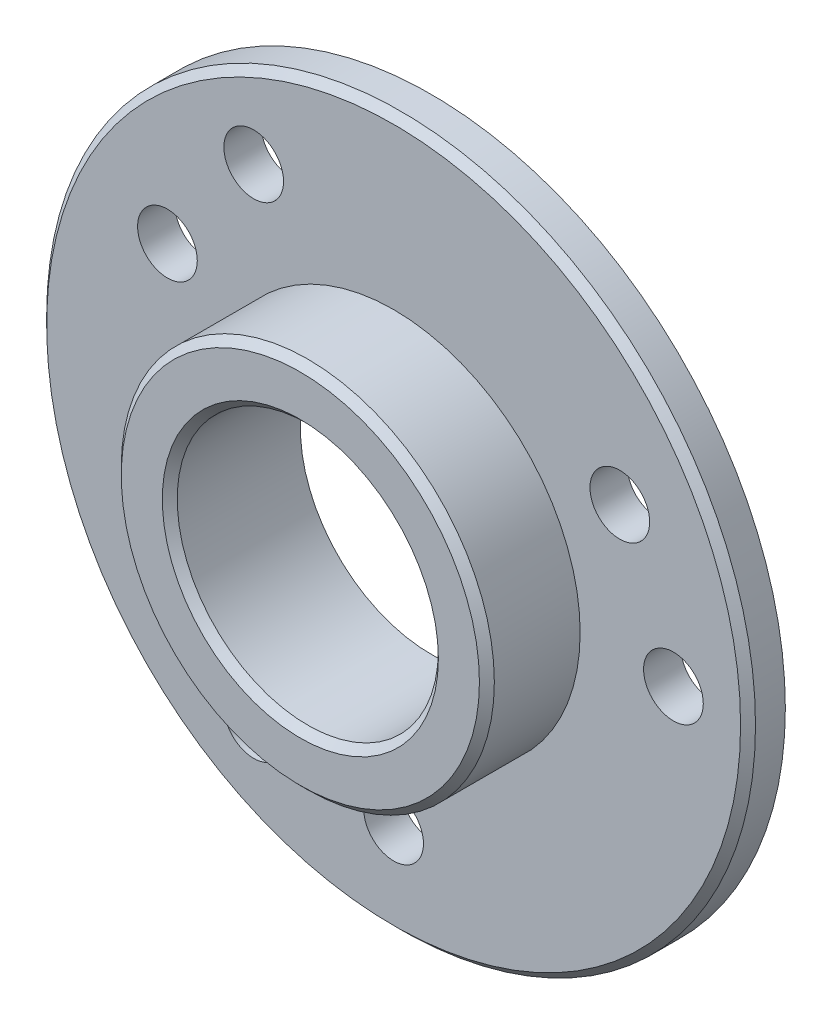
ISO-10303-21;
HEADER;
FILE_DESCRIPTION(('STEP AP214'),'2;1');
FILE_NAME('part.step','',(''),(''),'','','');
FILE_SCHEMA(('AUTOMOTIVE_DESIGN { 1 0 10303 214 1 1 1 1 }'));
ENDSEC;
DATA;
#1=APPLICATION_CONTEXT('core data for automotive mechanical design processes');
#2=APPLICATION_PROTOCOL_DEFINITION('international standard','automotive_design',2000,#1);
#3=PRODUCT_CONTEXT('',#1,'mechanical');
#4=PRODUCT('Part','Part','',(#3));
#5=PRODUCT_RELATED_PRODUCT_CATEGORY('part','',(#4));
#6=PRODUCT_DEFINITION_FORMATION('','',#4);
#7=PRODUCT_DEFINITION_CONTEXT('part definition',#1,'design');
#8=PRODUCT_DEFINITION('design','',#6,#7);
#9=PRODUCT_DEFINITION_SHAPE('','',#8);
#10=(LENGTH_UNIT() NAMED_UNIT(*) SI_UNIT(.MILLI.,.METRE.));
#11=(NAMED_UNIT(*) PLANE_ANGLE_UNIT() SI_UNIT($,.RADIAN.));
#12=(NAMED_UNIT(*) SI_UNIT($,.STERADIAN.) SOLID_ANGLE_UNIT());
#13=UNCERTAINTY_MEASURE_WITH_UNIT(LENGTH_MEASURE(1.E-05),#10,'distance_accuracy_value','');
#14=(GEOMETRIC_REPRESENTATION_CONTEXT(3) GLOBAL_UNCERTAINTY_ASSIGNED_CONTEXT((#13)) GLOBAL_UNIT_ASSIGNED_CONTEXT((#10,
#11,#12)) REPRESENTATION_CONTEXT('',''));
#15=CARTESIAN_POINT('',(0.,0.,0.));
#16=DIRECTION('',(0.,0.,1.));
#17=DIRECTION('',(1.,0.,0.));
#18=AXIS2_PLACEMENT_3D('',#15,#16,#17);
#19=CARTESIAN_POINT('',(0.,0.,2.));
#20=DIRECTION('',(0.,0.,1.));
#21=DIRECTION('',(1.,0.,0.));
#22=AXIS2_PLACEMENT_3D('',#19,#20,#21);
#23=PLANE('',#22);
#24=CARTESIAN_POINT('',(0.,0.,2.));
#25=DIRECTION('',(0.,0.,1.));
#26=DIRECTION('',(1.,0.,0.));
#27=AXIS2_PLACEMENT_3D('',#24,#25,#26);
#28=CIRCLE('',#27,18.6);
#29=CARTESIAN_POINT('',(18.6,0.,2.));
#30=VERTEX_POINT('',#29);
#31=EDGE_CURVE('E56',#30,#30,#28,.T.);
#32=ORIENTED_EDGE('',*,*,#31,.T.);
#33=EDGE_LOOP('',(#32));
#34=FACE_BOUND('',#33,.T.);
#35=CARTESIAN_POINT('',(0.,-14.,2.));
#36=DIRECTION('',(0.,0.,1.));
#37=DIRECTION('',(1.,0.,0.));
#38=AXIS2_PLACEMENT_3D('',#35,#36,#37);
#39=CIRCLE('',#38,1.6);
#40=CARTESIAN_POINT('',(1.6,-14.,2.));
#41=VERTEX_POINT('',#40);
#42=EDGE_CURVE('E59',#41,#41,#39,.T.);
#43=ORIENTED_EDGE('',*,*,#42,.F.);
#44=EDGE_LOOP('',(#43));
#45=FACE_BOUND('',#44,.T.);
#46=CARTESIAN_POINT('',(-12.1243556529821,7.00000000000006,2.));
#47=DIRECTION('',(0.,0.,1.));
#48=DIRECTION('',(1.,0.,0.));
#49=AXIS2_PLACEMENT_3D('',#46,#47,#48);
#50=CIRCLE('',#49,1.6);
#51=CARTESIAN_POINT('',(-10.5243556529821,7.00000000000006,2.));
#52=VERTEX_POINT('',#51);
#53=EDGE_CURVE('E88',#52,#52,#50,.T.);
#54=ORIENTED_EDGE('',*,*,#53,.F.);
#55=EDGE_LOOP('',(#54));
#56=FACE_BOUND('',#55,.T.);
#57=CARTESIAN_POINT('',(12.1243556529822,6.99999999999989,2.));
#58=DIRECTION('',(0.,0.,1.));
#59=DIRECTION('',(1.,0.,0.));
#60=AXIS2_PLACEMENT_3D('',#57,#58,#59);
#61=CIRCLE('',#60,1.6);
#62=CARTESIAN_POINT('',(13.7243556529822,6.99999999999989,2.));
#63=VERTEX_POINT('',#62);
#64=EDGE_CURVE('E91',#63,#63,#61,.T.);
#65=ORIENTED_EDGE('',*,*,#64,.F.);
#66=EDGE_LOOP('',(#65));
#67=FACE_BOUND('',#66,.T.);
#68=CARTESIAN_POINT('',(-7.49999999999992,12.9903810567666,2.));
#69=DIRECTION('',(0.,0.,1.));
#70=DIRECTION('',(1.,0.,0.));
#71=AXIS2_PLACEMENT_3D('',#68,#69,#70);
#72=CIRCLE('',#71,1.6);
#73=CARTESIAN_POINT('',(-5.89999999999992,12.9903810567666,2.));
#74=VERTEX_POINT('',#73);
#75=EDGE_CURVE('E94',#74,#74,#72,.T.);
#76=ORIENTED_EDGE('',*,*,#75,.F.);
#77=EDGE_LOOP('',(#76));
#78=FACE_BOUND('',#77,.T.);
#79=CARTESIAN_POINT('',(-7.50000000000001,-12.9903810567666,2.));
#80=DIRECTION('',(0.,0.,1.));
#81=DIRECTION('',(1.,0.,0.));
#82=AXIS2_PLACEMENT_3D('',#79,#80,#81);
#83=CIRCLE('',#82,1.6);
#84=CARTESIAN_POINT('',(-5.90000000000001,-12.9903810567666,2.));
#85=VERTEX_POINT('',#84);
#86=EDGE_CURVE('E97',#85,#85,#83,.T.);
#87=ORIENTED_EDGE('',*,*,#86,.F.);
#88=EDGE_LOOP('',(#87));
#89=FACE_BOUND('',#88,.T.);
#90=CARTESIAN_POINT('',(15.,-1.55257751099924E-13,2.));
#91=DIRECTION('',(0.,0.,1.));
#92=DIRECTION('',(1.,0.,0.));
#93=AXIS2_PLACEMENT_3D('',#90,#91,#92);
#94=CIRCLE('',#93,1.6);
#95=CARTESIAN_POINT('',(16.6,-1.55257751099924E-13,2.));
#96=VERTEX_POINT('',#95);
#97=EDGE_CURVE('E63',#96,#96,#94,.T.);
#98=ORIENTED_EDGE('',*,*,#97,.F.);
#99=EDGE_LOOP('',(#98));
#100=FACE_BOUND('',#99,.T.);
#101=CARTESIAN_POINT('',(0.,0.,2.));
#102=DIRECTION('',(0.,0.,1.));
#103=DIRECTION('',(1.,0.,0.));
#104=AXIS2_PLACEMENT_3D('',#101,#102,#103);
#105=CIRCLE('',#104,10.);
#106=CARTESIAN_POINT('',(10.,0.,2.));
#107=VERTEX_POINT('',#106);
#108=EDGE_CURVE('E85',#107,#107,#105,.F.);
#109=ORIENTED_EDGE('',*,*,#108,.T.);
#110=EDGE_LOOP('',(#109));
#111=FACE_BOUND('',#110,.T.);
#112=ADVANCED_FACE('F33',(#34,#45,#56,#67,#78,#89,#100,#111),#23,.T.);
#113=CARTESIAN_POINT('',(0.,-14.,2.));
#114=DIRECTION('',(0.,0.,-1.));
#115=DIRECTION('',(-1.,0.,0.));
#116=AXIS2_PLACEMENT_3D('',#113,#114,#115);
#117=CYLINDRICAL_SURFACE('',#116,1.6);
#118=ORIENTED_EDGE('',*,*,#42,.T.);
#119=EDGE_LOOP('',(#118));
#120=FACE_BOUND('',#119,.T.);
#121=CARTESIAN_POINT('',(0.,-14.,0.));
#122=DIRECTION('',(0.,0.,1.));
#123=DIRECTION('',(1.,0.,0.));
#124=AXIS2_PLACEMENT_3D('',#121,#122,#123);
#125=CIRCLE('',#124,1.6);
#126=CARTESIAN_POINT('',(1.6,-14.,0.));
#127=VERTEX_POINT('',#126);
#128=EDGE_CURVE('E64',#127,#127,#125,.T.);
#129=ORIENTED_EDGE('',*,*,#128,.F.);
#130=EDGE_LOOP('',(#129));
#131=FACE_BOUND('',#130,.T.);
#132=ADVANCED_FACE('F122',(#120,#131),#117,.F.);
#133=CARTESIAN_POINT('',(-12.1243556529821,7.00000000000006,2.));
#134=DIRECTION('',(0.,0.,-1.));
#135=DIRECTION('',(-1.,0.,0.));
#136=AXIS2_PLACEMENT_3D('',#133,#134,#135);
#137=CYLINDRICAL_SURFACE('',#136,1.6);
#138=ORIENTED_EDGE('',*,*,#53,.T.);
#139=EDGE_LOOP('',(#138));
#140=FACE_BOUND('',#139,.T.);
#141=CARTESIAN_POINT('',(-12.1243556529821,7.00000000000006,0.));
#142=DIRECTION('',(0.,0.,1.));
#143=DIRECTION('',(1.,0.,0.));
#144=AXIS2_PLACEMENT_3D('',#141,#142,#143);
#145=CIRCLE('',#144,1.6);
#146=CARTESIAN_POINT('',(-10.5243556529821,7.00000000000006,0.));
#147=VERTEX_POINT('',#146);
#148=EDGE_CURVE('E67',#147,#147,#145,.T.);
#149=ORIENTED_EDGE('',*,*,#148,.F.);
#150=EDGE_LOOP('',(#149));
#151=FACE_BOUND('',#150,.T.);
#152=ADVANCED_FACE('F127',(#140,#151),#137,.F.);
#153=CARTESIAN_POINT('',(0.,0.,2.));
#154=DIRECTION('',(0.,0.,-1.));
#155=DIRECTION('',(-1.,0.,0.));
#156=AXIS2_PLACEMENT_3D('',#153,#154,#155);
#157=CYLINDRICAL_SURFACE('',#156,7.);
#158=CARTESIAN_POINT('',(0.,0.,6.59999999999999));
#159=DIRECTION('',(0.,0.,1.));
#160=DIRECTION('',(1.,0.,0.));
#161=AXIS2_PLACEMENT_3D('',#158,#159,#160);
#162=CIRCLE('',#161,7.);
#163=CARTESIAN_POINT('',(7.,0.,6.59999999999999));
#164=VERTEX_POINT('',#163);
#165=EDGE_CURVE('E48',#164,#164,#162,.T.);
#166=ORIENTED_EDGE('',*,*,#165,.T.);
#167=EDGE_LOOP('',(#166));
#168=FACE_BOUND('',#167,.T.);
#169=CARTESIAN_POINT('',(0.,0.,0.));
#170=DIRECTION('',(0.,0.,1.));
#171=DIRECTION('',(1.,0.,0.));
#172=AXIS2_PLACEMENT_3D('',#169,#170,#171);
#173=CIRCLE('',#172,7.);
#174=CARTESIAN_POINT('',(7.,0.,0.));
#175=VERTEX_POINT('',#174);
#176=EDGE_CURVE('E70',#175,#175,#173,.T.);
#177=ORIENTED_EDGE('',*,*,#176,.F.);
#178=EDGE_LOOP('',(#177));
#179=FACE_BOUND('',#178,.T.);
#180=ADVANCED_FACE('F138',(#168,#179),#157,.F.);
#181=CARTESIAN_POINT('',(12.1243556529822,6.99999999999989,2.));
#182=DIRECTION('',(0.,0.,-1.));
#183=DIRECTION('',(-1.,0.,0.));
#184=AXIS2_PLACEMENT_3D('',#181,#182,#183);
#185=CYLINDRICAL_SURFACE('',#184,1.6);
#186=ORIENTED_EDGE('',*,*,#64,.T.);
#187=EDGE_LOOP('',(#186));
#188=FACE_BOUND('',#187,.T.);
#189=CARTESIAN_POINT('',(12.1243556529822,6.99999999999989,0.));
#190=DIRECTION('',(0.,0.,1.));
#191=DIRECTION('',(1.,0.,0.));
#192=AXIS2_PLACEMENT_3D('',#189,#190,#191);
#193=CIRCLE('',#192,1.6);
#194=CARTESIAN_POINT('',(13.7243556529822,6.99999999999989,0.));
#195=VERTEX_POINT('',#194);
#196=EDGE_CURVE('E73',#195,#195,#193,.T.);
#197=ORIENTED_EDGE('',*,*,#196,.F.);
#198=EDGE_LOOP('',(#197));
#199=FACE_BOUND('',#198,.T.);
#200=ADVANCED_FACE('F142',(#188,#199),#185,.F.);
#201=CARTESIAN_POINT('',(-7.49999999999992,12.9903810567666,2.));
#202=DIRECTION('',(0.,0.,-1.));
#203=DIRECTION('',(-1.,0.,0.));
#204=AXIS2_PLACEMENT_3D('',#201,#202,#203);
#205=CYLINDRICAL_SURFACE('',#204,1.6);
#206=ORIENTED_EDGE('',*,*,#75,.T.);
#207=EDGE_LOOP('',(#206));
#208=FACE_BOUND('',#207,.T.);
#209=CARTESIAN_POINT('',(-7.49999999999992,12.9903810567666,0.));
#210=DIRECTION('',(0.,0.,1.));
#211=DIRECTION('',(1.,0.,0.));
#212=AXIS2_PLACEMENT_3D('',#209,#210,#211);
#213=CIRCLE('',#212,1.6);
#214=CARTESIAN_POINT('',(-5.89999999999992,12.9903810567666,0.));
#215=VERTEX_POINT('',#214);
#216=EDGE_CURVE('E76',#215,#215,#213,.T.);
#217=ORIENTED_EDGE('',*,*,#216,.F.);
#218=EDGE_LOOP('',(#217));
#219=FACE_BOUND('',#218,.T.);
#220=ADVANCED_FACE('F146',(#208,#219),#205,.F.);
#221=CARTESIAN_POINT('',(-7.50000000000001,-12.9903810567666,2.));
#222=DIRECTION('',(0.,0.,-1.));
#223=DIRECTION('',(-1.,0.,0.));
#224=AXIS2_PLACEMENT_3D('',#221,#222,#223);
#225=CYLINDRICAL_SURFACE('',#224,1.6);
#226=ORIENTED_EDGE('',*,*,#86,.T.);
#227=EDGE_LOOP('',(#226));
#228=FACE_BOUND('',#227,.T.);
#229=CARTESIAN_POINT('',(-7.50000000000001,-12.9903810567666,0.));
#230=DIRECTION('',(0.,0.,1.));
#231=DIRECTION('',(1.,0.,0.));
#232=AXIS2_PLACEMENT_3D('',#229,#230,#231);
#233=CIRCLE('',#232,1.6);
#234=CARTESIAN_POINT('',(-5.90000000000001,-12.9903810567666,0.));
#235=VERTEX_POINT('',#234);
#236=EDGE_CURVE('E79',#235,#235,#233,.T.);
#237=ORIENTED_EDGE('',*,*,#236,.F.);
#238=EDGE_LOOP('',(#237));
#239=FACE_BOUND('',#238,.T.);
#240=ADVANCED_FACE('F150',(#228,#239),#225,.F.);
#241=CARTESIAN_POINT('',(15.,-1.55257751099924E-13,2.));
#242=DIRECTION('',(0.,0.,-1.));
#243=DIRECTION('',(-1.,0.,0.));
#244=AXIS2_PLACEMENT_3D('',#241,#242,#243);
#245=CYLINDRICAL_SURFACE('',#244,1.6);
#246=ORIENTED_EDGE('',*,*,#97,.T.);
#247=EDGE_LOOP('',(#246));
#248=FACE_BOUND('',#247,.T.);
#249=CARTESIAN_POINT('',(15.,-1.55257751099924E-13,0.));
#250=DIRECTION('',(0.,0.,1.));
#251=DIRECTION('',(1.,0.,0.));
#252=AXIS2_PLACEMENT_3D('',#249,#250,#251);
#253=CIRCLE('',#252,1.6);
#254=CARTESIAN_POINT('',(16.6,-1.55257751099924E-13,0.));
#255=VERTEX_POINT('',#254);
#256=EDGE_CURVE('E82',#255,#255,#253,.T.);
#257=ORIENTED_EDGE('',*,*,#256,.F.);
#258=EDGE_LOOP('',(#257));
#259=FACE_BOUND('',#258,.T.);
#260=ADVANCED_FACE('F133',(#248,#259),#245,.F.);
#261=CARTESIAN_POINT('',(0.,0.,2.));
#262=DIRECTION('',(0.,0.,-1.));
#263=DIRECTION('',(-1.,0.,0.));
#264=AXIS2_PLACEMENT_3D('',#261,#262,#263);
#265=CYLINDRICAL_SURFACE('',#264,19.);
#266=CARTESIAN_POINT('',(0.,0.,1.6));
#267=DIRECTION('',(0.,0.,1.));
#268=DIRECTION('',(1.,0.,0.));
#269=AXIS2_PLACEMENT_3D('',#266,#267,#268);
#270=CIRCLE('',#269,19.);
#271=CARTESIAN_POINT('',(19.,0.,1.6));
#272=VERTEX_POINT('',#271);
#273=EDGE_CURVE('E53',#272,#272,#270,.F.);
#274=ORIENTED_EDGE('',*,*,#273,.T.);
#275=EDGE_LOOP('',(#274));
#276=FACE_BOUND('',#275,.T.);
#277=CARTESIAN_POINT('',(0.,0.,0.));
#278=DIRECTION('',(0.,0.,1.));
#279=DIRECTION('',(1.,0.,0.));
#280=AXIS2_PLACEMENT_3D('',#277,#278,#279);
#281=CIRCLE('',#280,19.);
#282=CARTESIAN_POINT('',(19.,0.,0.));
#283=VERTEX_POINT('',#282);
#284=EDGE_CURVE('E60',#283,#283,#281,.T.);
#285=ORIENTED_EDGE('',*,*,#284,.T.);
#286=EDGE_LOOP('',(#285));
#287=FACE_BOUND('',#286,.T.);
#288=ADVANCED_FACE('F117',(#276,#287),#265,.T.);
#289=CARTESIAN_POINT('',(0.,0.,0.));
#290=DIRECTION('',(0.,0.,1.));
#291=DIRECTION('',(1.,0.,0.));
#292=AXIS2_PLACEMENT_3D('',#289,#290,#291);
#293=PLANE('',#292);
#294=ORIENTED_EDGE('',*,*,#176,.T.);
#295=EDGE_LOOP('',(#294));
#296=FACE_BOUND('',#295,.T.);
#297=ORIENTED_EDGE('',*,*,#284,.F.);
#298=EDGE_LOOP('',(#297));
#299=FACE_BOUND('',#298,.T.);
#300=ORIENTED_EDGE('',*,*,#128,.T.);
#301=EDGE_LOOP('',(#300));
#302=FACE_BOUND('',#301,.T.);
#303=ORIENTED_EDGE('',*,*,#148,.T.);
#304=EDGE_LOOP('',(#303));
#305=FACE_BOUND('',#304,.T.);
#306=ORIENTED_EDGE('',*,*,#196,.T.);
#307=EDGE_LOOP('',(#306));
#308=FACE_BOUND('',#307,.T.);
#309=ORIENTED_EDGE('',*,*,#216,.T.);
#310=EDGE_LOOP('',(#309));
#311=FACE_BOUND('',#310,.T.);
#312=ORIENTED_EDGE('',*,*,#236,.T.);
#313=EDGE_LOOP('',(#312));
#314=FACE_BOUND('',#313,.T.);
#315=ORIENTED_EDGE('',*,*,#256,.T.);
#316=EDGE_LOOP('',(#315));
#317=FACE_BOUND('',#316,.T.);
#318=ADVANCED_FACE('F109',(#296,#299,#302,#305,#308,#311,#314,#317),#293,.F.);
#319=CARTESIAN_POINT('',(0.,0.,7.));
#320=DIRECTION('',(0.,0.,-1.));
#321=DIRECTION('',(-1.,0.,0.));
#322=AXIS2_PLACEMENT_3D('',#319,#320,#321);
#323=CYLINDRICAL_SURFACE('',#322,10.);
#324=CARTESIAN_POINT('',(0.,0.,6.59999999999999));
#325=DIRECTION('',(0.,0.,1.));
#326=DIRECTION('',(1.,0.,0.));
#327=AXIS2_PLACEMENT_3D('',#324,#325,#326);
#328=CIRCLE('',#327,10.);
#329=CARTESIAN_POINT('',(10.,0.,6.59999999999999));
#330=VERTEX_POINT('',#329);
#331=EDGE_CURVE('E10',#330,#330,#328,.F.);
#332=ORIENTED_EDGE('',*,*,#331,.T.);
#333=EDGE_LOOP('',(#332));
#334=FACE_BOUND('',#333,.T.);
#335=ORIENTED_EDGE('',*,*,#108,.F.);
#336=EDGE_LOOP('',(#335));
#337=FACE_BOUND('',#336,.T.);
#338=ADVANCED_FACE('F106',(#334,#337),#323,.T.);
#339=CARTESIAN_POINT('',(0.,0.,7.));
#340=DIRECTION('',(0.,0.,1.));
#341=DIRECTION('',(1.,0.,0.));
#342=AXIS2_PLACEMENT_3D('',#339,#340,#341);
#343=PLANE('',#342);
#344=CARTESIAN_POINT('',(0.,0.,7.));
#345=DIRECTION('',(0.,0.,1.));
#346=DIRECTION('',(1.,0.,0.));
#347=AXIS2_PLACEMENT_3D('',#344,#345,#346);
#348=CIRCLE('',#347,7.4);
#349=CARTESIAN_POINT('',(7.4,0.,7.));
#350=VERTEX_POINT('',#349);
#351=EDGE_CURVE('E40',#350,#350,#348,.F.);
#352=ORIENTED_EDGE('',*,*,#351,.T.);
#353=EDGE_LOOP('',(#352));
#354=FACE_BOUND('',#353,.T.);
#355=CARTESIAN_POINT('',(0.,0.,7.));
#356=DIRECTION('',(0.,0.,1.));
#357=DIRECTION('',(1.,0.,0.));
#358=AXIS2_PLACEMENT_3D('',#355,#356,#357);
#359=CIRCLE('',#358,9.59999999999999);
#360=CARTESIAN_POINT('',(9.59999999999999,0.,7.));
#361=VERTEX_POINT('',#360);
#362=EDGE_CURVE('E44',#361,#361,#359,.T.);
#363=ORIENTED_EDGE('',*,*,#362,.T.);
#364=EDGE_LOOP('',(#363));
#365=FACE_BOUND('',#364,.T.);
#366=ADVANCED_FACE('F108',(#354,#365),#343,.T.);
#367=CARTESIAN_POINT('',(0.,0.,2.));
#368=DIRECTION('',(0.,0.,-1.));
#369=DIRECTION('',(-1.,0.,0.));
#370=AXIS2_PLACEMENT_3D('',#367,#368,#369);
#371=CONICAL_SURFACE('',#370,18.6,0.785398163397461);
#372=ORIENTED_EDGE('',*,*,#273,.F.);
#373=EDGE_LOOP('',(#372));
#374=FACE_BOUND('',#373,.T.);
#375=ORIENTED_EDGE('',*,*,#31,.F.);
#376=EDGE_LOOP('',(#375));
#377=FACE_BOUND('',#376,.T.);
#378=ADVANCED_FACE('F115',(#374,#377),#371,.T.);
#379=CARTESIAN_POINT('',(0.,0.,6.59999999999999));
#380=DIRECTION('',(0.,0.,1.));
#381=DIRECTION('',(1.,0.,0.));
#382=AXIS2_PLACEMENT_3D('',#379,#380,#381);
#383=CONICAL_SURFACE('',#382,7.,0.785398163397445);
#384=ORIENTED_EDGE('',*,*,#351,.F.);
#385=EDGE_LOOP('',(#384));
#386=FACE_BOUND('',#385,.T.);
#387=ORIENTED_EDGE('',*,*,#165,.F.);
#388=EDGE_LOOP('',(#387));
#389=FACE_BOUND('',#388,.T.);
#390=ADVANCED_FACE('F159',(#386,#389),#383,.F.);
#391=CARTESIAN_POINT('',(0.,0.,7.));
#392=DIRECTION('',(0.,0.,-1.));
#393=DIRECTION('',(-1.,0.,0.));
#394=AXIS2_PLACEMENT_3D('',#391,#392,#393);
#395=CONICAL_SURFACE('',#394,9.59999999999999,0.785398163397442);
#396=ORIENTED_EDGE('',*,*,#331,.F.);
#397=EDGE_LOOP('',(#396));
#398=FACE_BOUND('',#397,.T.);
#399=ORIENTED_EDGE('',*,*,#362,.F.);
#400=EDGE_LOOP('',(#399));
#401=FACE_BOUND('',#400,.T.);
#402=ADVANCED_FACE('F35',(#398,#401),#395,.T.);
#403=CLOSED_SHELL('',(#112,#132,#152,#180,#200,#220,#240,#260,#288,#318,#338,#366,#378,#390,#402));
#404=MANIFOLD_SOLID_BREP('B2',#403);
#405=ADVANCED_BREP_SHAPE_REPRESENTATION('',(#18,#404),#14);
#406=SHAPE_DEFINITION_REPRESENTATION(#9,#405);
ENDSEC;
END-ISO-10303-21;
